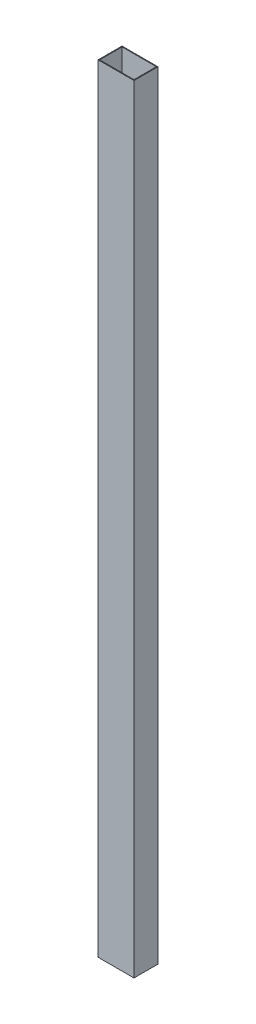
ISO-10303-21;
HEADER;
FILE_DESCRIPTION(('STEP AP214'),'2;1');
FILE_NAME('part.step','',(''),(''),'','','');
FILE_SCHEMA(('AUTOMOTIVE_DESIGN { 1 0 10303 214 1 1 1 1 }'));
ENDSEC;
DATA;
#1=APPLICATION_CONTEXT('core data for automotive mechanical design processes');
#2=APPLICATION_PROTOCOL_DEFINITION('international standard','automotive_design',2000,#1);
#3=PRODUCT_CONTEXT('',#1,'mechanical');
#4=PRODUCT('Part','Part','',(#3));
#5=PRODUCT_RELATED_PRODUCT_CATEGORY('part','',(#4));
#6=PRODUCT_DEFINITION_FORMATION('','',#4);
#7=PRODUCT_DEFINITION_CONTEXT('part definition',#1,'design');
#8=PRODUCT_DEFINITION('design','',#6,#7);
#9=PRODUCT_DEFINITION_SHAPE('','',#8);
#10=(LENGTH_UNIT() NAMED_UNIT(*) SI_UNIT(.MILLI.,.METRE.));
#11=(NAMED_UNIT(*) PLANE_ANGLE_UNIT() SI_UNIT($,.RADIAN.));
#12=(NAMED_UNIT(*) SI_UNIT($,.STERADIAN.) SOLID_ANGLE_UNIT());
#13=UNCERTAINTY_MEASURE_WITH_UNIT(LENGTH_MEASURE(1.E-05),#10,'distance_accuracy_value','');
#14=(GEOMETRIC_REPRESENTATION_CONTEXT(3) GLOBAL_UNCERTAINTY_ASSIGNED_CONTEXT((#13)) GLOBAL_UNIT_ASSIGNED_CONTEXT((#10,
#11,#12)) REPRESENTATION_CONTEXT('',''));
#15=CARTESIAN_POINT('',(0.,0.,0.));
#16=DIRECTION('',(0.,0.,1.));
#17=DIRECTION('',(1.,0.,0.));
#18=AXIS2_PLACEMENT_3D('',#15,#16,#17);
#19=CARTESIAN_POINT('',(0.,1651.,0.));
#20=DIRECTION('',(0.,1.,0.));
#21=DIRECTION('',(0.,0.,1.));
#22=AXIS2_PLACEMENT_3D('',#19,#20,#21);
#23=PLANE('',#22);
#24=DIRECTION('',(0.,0.,-1.));
#25=VECTOR('',#24,1.);
#26=CARTESIAN_POINT('',(0.,1651.,0.));
#27=LINE('',#26,#25);
#28=CARTESIAN_POINT('',(0.,1651.,0.));
#29=VERTEX_POINT('',#28);
#30=CARTESIAN_POINT('',(0.,1651.,-50.8));
#31=VERTEX_POINT('',#30);
#32=EDGE_CURVE('E134',#29,#31,#27,.T.);
#33=ORIENTED_EDGE('',*,*,#32,.T.);
#34=DIRECTION('',(-1.,0.,0.));
#35=VECTOR('',#34,1.);
#36=CARTESIAN_POINT('',(0.,1651.,-50.8));
#37=LINE('',#36,#35);
#38=CARTESIAN_POINT('',(-76.2,1651.,-50.8));
#39=VERTEX_POINT('',#38);
#40=EDGE_CURVE('E137',#31,#39,#37,.T.);
#41=ORIENTED_EDGE('',*,*,#40,.T.);
#42=DIRECTION('',(0.,0.,1.));
#43=VECTOR('',#42,1.);
#44=CARTESIAN_POINT('',(-76.2,1651.,0.));
#45=LINE('',#44,#43);
#46=CARTESIAN_POINT('',(-76.2,1651.,0.));
#47=VERTEX_POINT('',#46);
#48=EDGE_CURVE('E140',#39,#47,#45,.T.);
#49=ORIENTED_EDGE('',*,*,#48,.T.);
#50=DIRECTION('',(1.,0.,0.));
#51=VECTOR('',#50,1.);
#52=CARTESIAN_POINT('',(0.,1651.,0.));
#53=LINE('',#52,#51);
#54=EDGE_CURVE('E142',#47,#29,#53,.T.);
#55=ORIENTED_EDGE('',*,*,#54,.T.);
#56=EDGE_LOOP('',(#33,#41,#49,#55));
#57=FACE_BOUND('',#56,.T.);
#58=DIRECTION('',(1.,0.,0.));
#59=VECTOR('',#58,1.);
#60=CARTESIAN_POINT('',(-74.6125,1651.,-1.58749999999999));
#61=LINE('',#60,#59);
#62=CARTESIAN_POINT('',(-74.6125,1651.,-1.58749999999999));
#63=VERTEX_POINT('',#62);
#64=CARTESIAN_POINT('',(-1.58750000000001,1651.,-1.58749999999999));
#65=VERTEX_POINT('',#64);
#66=EDGE_CURVE('E106',#63,#65,#61,.T.);
#67=ORIENTED_EDGE('',*,*,#66,.F.);
#68=DIRECTION('',(0.,0.,1.));
#69=VECTOR('',#68,1.);
#70=CARTESIAN_POINT('',(-74.6125,1651.,-1.58749999999999));
#71=LINE('',#70,#69);
#72=CARTESIAN_POINT('',(-74.6125,1651.,-49.2125));
#73=VERTEX_POINT('',#72);
#74=EDGE_CURVE('E98',#73,#63,#71,.T.);
#75=ORIENTED_EDGE('',*,*,#74,.F.);
#76=DIRECTION('',(-1.,0.,0.));
#77=VECTOR('',#76,1.);
#78=CARTESIAN_POINT('',(-74.6125,1651.,-49.2125));
#79=LINE('',#78,#77);
#80=CARTESIAN_POINT('',(-1.58750000000001,1651.,-49.2125));
#81=VERTEX_POINT('',#80);
#82=EDGE_CURVE('E120',#81,#73,#79,.T.);
#83=ORIENTED_EDGE('',*,*,#82,.F.);
#84=DIRECTION('',(0.,0.,-1.));
#85=VECTOR('',#84,1.);
#86=CARTESIAN_POINT('',(-1.58750000000001,1651.,-1.58749999999999));
#87=LINE('',#86,#85);
#88=EDGE_CURVE('E118',#65,#81,#87,.T.);
#89=ORIENTED_EDGE('',*,*,#88,.F.);
#90=EDGE_LOOP('',(#67,#75,#83,#89));
#91=FACE_BOUND('',#90,.T.);
#92=ADVANCED_FACE('F33',(#57,#91),#23,.T.);
#93=CARTESIAN_POINT('',(0.,0.,0.));
#94=DIRECTION('',(0.,1.,0.));
#95=DIRECTION('',(0.,0.,1.));
#96=AXIS2_PLACEMENT_3D('',#93,#94,#95);
#97=PLANE('',#96);
#98=DIRECTION('',(0.,0.,-1.));
#99=VECTOR('',#98,1.);
#100=CARTESIAN_POINT('',(0.,0.,0.));
#101=LINE('',#100,#99);
#102=CARTESIAN_POINT('',(0.,0.,0.));
#103=VERTEX_POINT('',#102);
#104=CARTESIAN_POINT('',(0.,0.,-50.8));
#105=VERTEX_POINT('',#104);
#106=EDGE_CURVE('E114',#103,#105,#101,.T.);
#107=ORIENTED_EDGE('',*,*,#106,.F.);
#108=DIRECTION('',(1.,0.,0.));
#109=VECTOR('',#108,1.);
#110=CARTESIAN_POINT('',(0.,0.,0.));
#111=LINE('',#110,#109);
#112=CARTESIAN_POINT('',(-76.2,0.,0.));
#113=VERTEX_POINT('',#112);
#114=EDGE_CURVE('E138',#113,#103,#111,.T.);
#115=ORIENTED_EDGE('',*,*,#114,.F.);
#116=DIRECTION('',(0.,0.,1.));
#117=VECTOR('',#116,1.);
#118=CARTESIAN_POINT('',(-76.2,0.,0.));
#119=LINE('',#118,#117);
#120=CARTESIAN_POINT('',(-76.2,0.,-50.8));
#121=VERTEX_POINT('',#120);
#122=EDGE_CURVE('E149',#121,#113,#119,.T.);
#123=ORIENTED_EDGE('',*,*,#122,.F.);
#124=DIRECTION('',(-1.,0.,0.));
#125=VECTOR('',#124,1.);
#126=CARTESIAN_POINT('',(0.,0.,-50.8));
#127=LINE('',#126,#125);
#128=EDGE_CURVE('E147',#105,#121,#127,.T.);
#129=ORIENTED_EDGE('',*,*,#128,.F.);
#130=EDGE_LOOP('',(#107,#115,#123,#129));
#131=FACE_BOUND('',#130,.T.);
#132=DIRECTION('',(0.,0.,1.));
#133=VECTOR('',#132,1.);
#134=CARTESIAN_POINT('',(-74.6125,0.,-1.58749999999999));
#135=LINE('',#134,#133);
#136=CARTESIAN_POINT('',(-74.6125,0.,-49.2125));
#137=VERTEX_POINT('',#136);
#138=CARTESIAN_POINT('',(-74.6125,0.,-1.58749999999999));
#139=VERTEX_POINT('',#138);
#140=EDGE_CURVE('E56',#137,#139,#135,.T.);
#141=ORIENTED_EDGE('',*,*,#140,.T.);
#142=DIRECTION('',(1.,0.,0.));
#143=VECTOR('',#142,1.);
#144=CARTESIAN_POINT('',(-74.6125,0.,-1.58749999999999));
#145=LINE('',#144,#143);
#146=CARTESIAN_POINT('',(-1.58750000000001,0.,-1.58749999999999));
#147=VERTEX_POINT('',#146);
#148=EDGE_CURVE('E113',#139,#147,#145,.T.);
#149=ORIENTED_EDGE('',*,*,#148,.T.);
#150=DIRECTION('',(0.,0.,-1.));
#151=VECTOR('',#150,1.);
#152=CARTESIAN_POINT('',(-1.58750000000001,0.,-1.58749999999999));
#153=LINE('',#152,#151);
#154=CARTESIAN_POINT('',(-1.58750000000001,0.,-49.2125));
#155=VERTEX_POINT('',#154);
#156=EDGE_CURVE('E126',#147,#155,#153,.T.);
#157=ORIENTED_EDGE('',*,*,#156,.T.);
#158=DIRECTION('',(-1.,0.,0.));
#159=VECTOR('',#158,1.);
#160=CARTESIAN_POINT('',(-74.6125,0.,-49.2125));
#161=LINE('',#160,#159);
#162=EDGE_CURVE('E107',#155,#137,#161,.T.);
#163=ORIENTED_EDGE('',*,*,#162,.T.);
#164=EDGE_LOOP('',(#141,#149,#157,#163));
#165=FACE_BOUND('',#164,.T.);
#166=ADVANCED_FACE('F167',(#131,#165),#97,.F.);
#167=CARTESIAN_POINT('',(0.,1651.,0.));
#168=DIRECTION('',(-1.,0.,0.));
#169=DIRECTION('',(0.,0.,1.));
#170=AXIS2_PLACEMENT_3D('',#167,#168,#169);
#171=PLANE('',#170);
#172=ORIENTED_EDGE('',*,*,#106,.T.);
#173=DIRECTION('',(0.,-1.,0.));
#174=VECTOR('',#173,1.);
#175=CARTESIAN_POINT('',(0.,1651.,-50.8));
#176=LINE('',#175,#174);
#177=EDGE_CURVE('E11',#31,#105,#176,.T.);
#178=ORIENTED_EDGE('',*,*,#177,.F.);
#179=ORIENTED_EDGE('',*,*,#32,.F.);
#180=DIRECTION('',(0.,-1.,0.));
#181=VECTOR('',#180,1.);
#182=CARTESIAN_POINT('',(0.,1651.,0.));
#183=LINE('',#182,#181);
#184=EDGE_CURVE('E144',#29,#103,#183,.T.);
#185=ORIENTED_EDGE('',*,*,#184,.T.);
#186=EDGE_LOOP('',(#172,#178,#179,#185));
#187=FACE_BOUND('',#186,.T.);
#188=ADVANCED_FACE('F35',(#187),#171,.F.);
#189=CARTESIAN_POINT('',(0.,1651.,-50.8));
#190=DIRECTION('',(0.,0.,1.));
#191=DIRECTION('',(1.,0.,0.));
#192=AXIS2_PLACEMENT_3D('',#189,#190,#191);
#193=PLANE('',#192);
#194=ORIENTED_EDGE('',*,*,#128,.T.);
#195=DIRECTION('',(0.,-1.,0.));
#196=VECTOR('',#195,1.);
#197=CARTESIAN_POINT('',(-76.2,1651.,-50.8));
#198=LINE('',#197,#196);
#199=EDGE_CURVE('E41',#39,#121,#198,.T.);
#200=ORIENTED_EDGE('',*,*,#199,.F.);
#201=ORIENTED_EDGE('',*,*,#40,.F.);
#202=ORIENTED_EDGE('',*,*,#177,.T.);
#203=EDGE_LOOP('',(#194,#200,#201,#202));
#204=FACE_BOUND('',#203,.T.);
#205=ADVANCED_FACE('F177',(#204),#193,.F.);
#206=CARTESIAN_POINT('',(-76.2,1651.,0.));
#207=DIRECTION('',(1.,0.,0.));
#208=DIRECTION('',(0.,0.,-1.));
#209=AXIS2_PLACEMENT_3D('',#206,#207,#208);
#210=PLANE('',#209);
#211=ORIENTED_EDGE('',*,*,#122,.T.);
#212=DIRECTION('',(0.,-1.,0.));
#213=VECTOR('',#212,1.);
#214=CARTESIAN_POINT('',(-76.2,1651.,0.));
#215=LINE('',#214,#213);
#216=EDGE_CURVE('E154',#47,#113,#215,.T.);
#217=ORIENTED_EDGE('',*,*,#216,.F.);
#218=ORIENTED_EDGE('',*,*,#48,.F.);
#219=ORIENTED_EDGE('',*,*,#199,.T.);
#220=EDGE_LOOP('',(#211,#217,#218,#219));
#221=FACE_BOUND('',#220,.T.);
#222=ADVANCED_FACE('F161',(#221),#210,.F.);
#223=CARTESIAN_POINT('',(0.,1651.,0.));
#224=DIRECTION('',(0.,0.,-1.));
#225=DIRECTION('',(-1.,0.,0.));
#226=AXIS2_PLACEMENT_3D('',#223,#224,#225);
#227=PLANE('',#226);
#228=ORIENTED_EDGE('',*,*,#114,.T.);
#229=ORIENTED_EDGE('',*,*,#184,.F.);
#230=ORIENTED_EDGE('',*,*,#54,.F.);
#231=ORIENTED_EDGE('',*,*,#216,.T.);
#232=EDGE_LOOP('',(#228,#229,#230,#231));
#233=FACE_BOUND('',#232,.T.);
#234=ADVANCED_FACE('F171',(#233),#227,.F.);
#235=CARTESIAN_POINT('',(-74.6125,1651.,-1.58749999999999));
#236=DIRECTION('',(1.,0.,0.));
#237=DIRECTION('',(0.,0.,-1.));
#238=AXIS2_PLACEMENT_3D('',#235,#236,#237);
#239=PLANE('',#238);
#240=ORIENTED_EDGE('',*,*,#140,.F.);
#241=DIRECTION('',(0.,-1.,0.));
#242=VECTOR('',#241,1.);
#243=CARTESIAN_POINT('',(-74.6125,1651.,-49.2125));
#244=LINE('',#243,#242);
#245=EDGE_CURVE('E102',#73,#137,#244,.T.);
#246=ORIENTED_EDGE('',*,*,#245,.F.);
#247=ORIENTED_EDGE('',*,*,#74,.T.);
#248=DIRECTION('',(0.,-1.,0.));
#249=VECTOR('',#248,1.);
#250=CARTESIAN_POINT('',(-74.6125,1651.,-1.58749999999999));
#251=LINE('',#250,#249);
#252=EDGE_CURVE('E101',#63,#139,#251,.T.);
#253=ORIENTED_EDGE('',*,*,#252,.T.);
#254=EDGE_LOOP('',(#240,#246,#247,#253));
#255=FACE_BOUND('',#254,.T.);
#256=ADVANCED_FACE('F100',(#255),#239,.T.);
#257=CARTESIAN_POINT('',(-74.6125,1651.,-1.58749999999999));
#258=DIRECTION('',(0.,0.,-1.));
#259=DIRECTION('',(-1.,0.,0.));
#260=AXIS2_PLACEMENT_3D('',#257,#258,#259);
#261=PLANE('',#260);
#262=ORIENTED_EDGE('',*,*,#148,.F.);
#263=ORIENTED_EDGE('',*,*,#252,.F.);
#264=ORIENTED_EDGE('',*,*,#66,.T.);
#265=DIRECTION('',(0.,-1.,0.));
#266=VECTOR('',#265,1.);
#267=CARTESIAN_POINT('',(-1.58750000000001,1651.,-1.58749999999999));
#268=LINE('',#267,#266);
#269=EDGE_CURVE('E115',#65,#147,#268,.T.);
#270=ORIENTED_EDGE('',*,*,#269,.T.);
#271=EDGE_LOOP('',(#262,#263,#264,#270));
#272=FACE_BOUND('',#271,.T.);
#273=ADVANCED_FACE('F110',(#272),#261,.T.);
#274=CARTESIAN_POINT('',(-1.58750000000001,1651.,-1.58749999999999));
#275=DIRECTION('',(-1.,0.,0.));
#276=DIRECTION('',(0.,0.,1.));
#277=AXIS2_PLACEMENT_3D('',#274,#275,#276);
#278=PLANE('',#277);
#279=ORIENTED_EDGE('',*,*,#156,.F.);
#280=ORIENTED_EDGE('',*,*,#269,.F.);
#281=ORIENTED_EDGE('',*,*,#88,.T.);
#282=DIRECTION('',(0.,-1.,0.));
#283=VECTOR('',#282,1.);
#284=CARTESIAN_POINT('',(-1.58750000000001,1651.,-49.2125));
#285=LINE('',#284,#283);
#286=EDGE_CURVE('E48',#81,#155,#285,.T.);
#287=ORIENTED_EDGE('',*,*,#286,.T.);
#288=EDGE_LOOP('',(#279,#280,#281,#287));
#289=FACE_BOUND('',#288,.T.);
#290=ADVANCED_FACE('F200',(#289),#278,.T.);
#291=CARTESIAN_POINT('',(-74.6125,1651.,-49.2125));
#292=DIRECTION('',(0.,0.,1.));
#293=DIRECTION('',(1.,0.,0.));
#294=AXIS2_PLACEMENT_3D('',#291,#292,#293);
#295=PLANE('',#294);
#296=ORIENTED_EDGE('',*,*,#162,.F.);
#297=ORIENTED_EDGE('',*,*,#286,.F.);
#298=ORIENTED_EDGE('',*,*,#82,.T.);
#299=ORIENTED_EDGE('',*,*,#245,.T.);
#300=EDGE_LOOP('',(#296,#297,#298,#299));
#301=FACE_BOUND('',#300,.T.);
#302=ADVANCED_FACE('F204',(#301),#295,.T.);
#303=CLOSED_SHELL('',(#92,#166,#188,#205,#222,#234,#256,#273,#290,#302));
#304=MANIFOLD_SOLID_BREP('B2',#303);
#305=ADVANCED_BREP_SHAPE_REPRESENTATION('',(#18,#304),#14);
#306=SHAPE_DEFINITION_REPRESENTATION(#9,#305);
ENDSEC;
END-ISO-10303-21;
